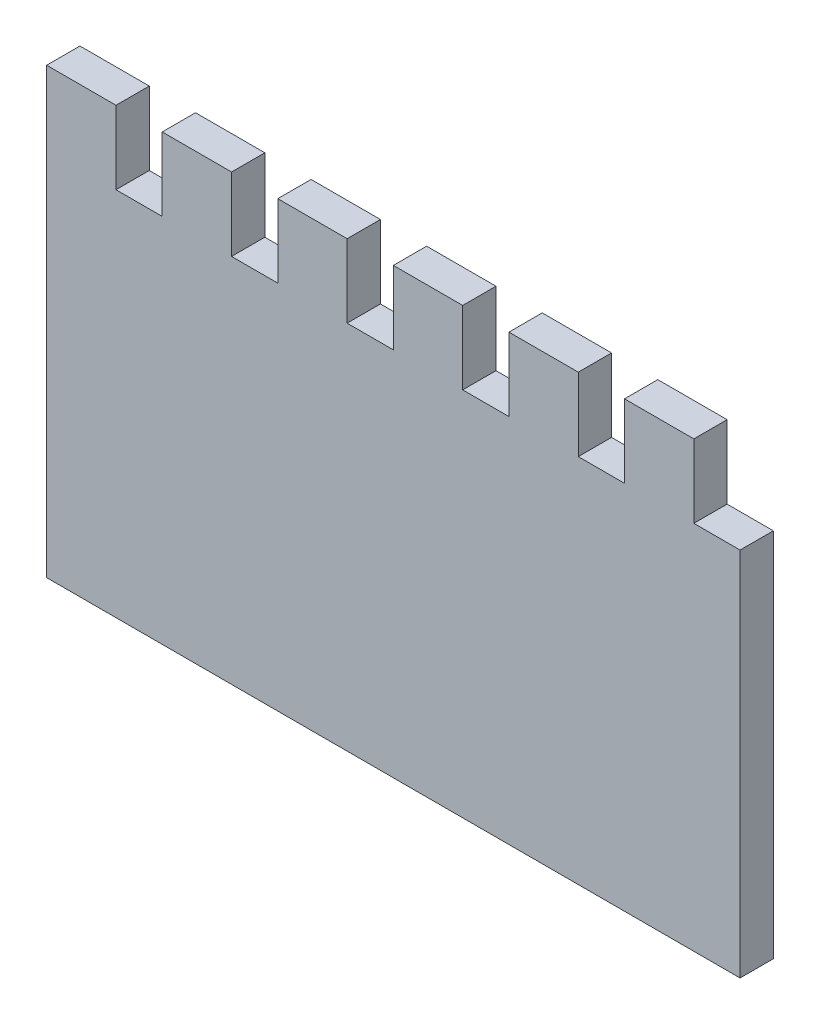
ISO-10303-21;
HEADER;
FILE_DESCRIPTION(('STEP AP214'),'2;1');
FILE_NAME('part.step','',(''),(''),'','','');
FILE_SCHEMA(('AUTOMOTIVE_DESIGN { 1 0 10303 214 1 1 1 1 }'));
ENDSEC;
DATA;
#1=APPLICATION_CONTEXT('core data for automotive mechanical design processes');
#2=APPLICATION_PROTOCOL_DEFINITION('international standard','automotive_design',2000,#1);
#3=PRODUCT_CONTEXT('',#1,'mechanical');
#4=PRODUCT('Part','Part','',(#3));
#5=PRODUCT_RELATED_PRODUCT_CATEGORY('part','',(#4));
#6=PRODUCT_DEFINITION_FORMATION('','',#4);
#7=PRODUCT_DEFINITION_CONTEXT('part definition',#1,'design');
#8=PRODUCT_DEFINITION('design','',#6,#7);
#9=PRODUCT_DEFINITION_SHAPE('','',#8);
#10=(LENGTH_UNIT() NAMED_UNIT(*) SI_UNIT(.MILLI.,.METRE.));
#11=(NAMED_UNIT(*) PLANE_ANGLE_UNIT() SI_UNIT($,.RADIAN.));
#12=(NAMED_UNIT(*) SI_UNIT($,.STERADIAN.) SOLID_ANGLE_UNIT());
#13=UNCERTAINTY_MEASURE_WITH_UNIT(LENGTH_MEASURE(1.E-05),#10,'distance_accuracy_value','');
#14=(GEOMETRIC_REPRESENTATION_CONTEXT(3) GLOBAL_UNCERTAINTY_ASSIGNED_CONTEXT((#13)) GLOBAL_UNIT_ASSIGNED_CONTEXT((#10,
#11,#12)) REPRESENTATION_CONTEXT('',''));
#15=CARTESIAN_POINT('',(0.,0.,0.));
#16=DIRECTION('',(0.,0.,1.));
#17=DIRECTION('',(1.,0.,0.));
#18=AXIS2_PLACEMENT_3D('',#15,#16,#17);
#19=CARTESIAN_POINT('',(0.,24384.,1828.8));
#20=DIRECTION('',(0.,-1.,0.));
#21=DIRECTION('',(0.,0.,-1.));
#22=AXIS2_PLACEMENT_3D('',#19,#20,#21);
#23=PLANE('',#22);
#24=DIRECTION('',(0.,0.,1.));
#25=VECTOR('',#24,1.);
#26=CARTESIAN_POINT('',(35560.,24384.,0.));
#27=LINE('',#26,#25);
#28=CARTESIAN_POINT('',(35560.,24384.,0.));
#29=VERTEX_POINT('',#28);
#30=CARTESIAN_POINT('',(35560.,24384.,1828.8));
#31=VERTEX_POINT('',#30);
#32=EDGE_CURVE('E215',#29,#31,#27,.T.);
#33=ORIENTED_EDGE('',*,*,#32,.F.);
#34=DIRECTION('',(-1.,0.,0.));
#35=VECTOR('',#34,1.);
#36=CARTESIAN_POINT('',(0.,24384.,0.));
#37=LINE('',#36,#35);
#38=CARTESIAN_POINT('',(31750.,24384.,0.));
#39=VERTEX_POINT('',#38);
#40=EDGE_CURVE('E234',#29,#39,#37,.T.);
#41=ORIENTED_EDGE('',*,*,#40,.T.);
#42=DIRECTION('',(0.,0.,1.));
#43=VECTOR('',#42,1.);
#44=CARTESIAN_POINT('',(31750.,24384.,0.));
#45=LINE('',#44,#43);
#46=CARTESIAN_POINT('',(31750.,24384.,1828.8));
#47=VERTEX_POINT('',#46);
#48=EDGE_CURVE('E376',#39,#47,#45,.T.);
#49=ORIENTED_EDGE('',*,*,#48,.T.);
#50=DIRECTION('',(-1.,0.,0.));
#51=VECTOR('',#50,1.);
#52=CARTESIAN_POINT('',(0.,24384.,1828.8));
#53=LINE('',#52,#51);
#54=EDGE_CURVE('E243',#31,#47,#53,.T.);
#55=ORIENTED_EDGE('',*,*,#54,.F.);
#56=EDGE_LOOP('',(#33,#41,#49,#55));
#57=FACE_BOUND('',#56,.T.);
#58=ADVANCED_FACE('F34',(#57),#23,.F.);
#59=CARTESIAN_POINT('',(0.,0.,1828.8));
#60=DIRECTION('',(0.,0.,-1.));
#61=DIRECTION('',(-1.,0.,0.));
#62=AXIS2_PLACEMENT_3D('',#59,#60,#61);
#63=PLANE('',#62);
#64=DIRECTION('',(-1.,0.,0.));
#65=VECTOR('',#64,1.);
#66=CARTESIAN_POINT('',(-1.1393720921813E-10,20364.7505525804,1828.8));
#67=LINE('',#66,#65);
#68=CARTESIAN_POINT('',(38100.,20364.7505525806,1828.8));
#69=VERTEX_POINT('',#68);
#70=CARTESIAN_POINT('',(35560.,20364.7505525806,1828.8));
#71=VERTEX_POINT('',#70);
#72=EDGE_CURVE('E49',#69,#71,#67,.T.);
#73=ORIENTED_EDGE('',*,*,#72,.T.);
#74=DIRECTION('',(0.,1.,0.));
#75=VECTOR('',#74,1.);
#76=CARTESIAN_POINT('',(35560.,0.,1828.8));
#77=LINE('',#76,#75);
#78=EDGE_CURVE('E224',#71,#31,#77,.T.);
#79=ORIENTED_EDGE('',*,*,#78,.T.);
#80=ORIENTED_EDGE('',*,*,#54,.T.);
#81=DIRECTION('',(0.,-1.,0.));
#82=VECTOR('',#81,1.);
#83=CARTESIAN_POINT('',(31750.0000000001,8.4193823332617E-11,1828.8));
#84=LINE('',#83,#82);
#85=CARTESIAN_POINT('',(31750.,20364.7505525806,1828.8));
#86=VERTEX_POINT('',#85);
#87=EDGE_CURVE('E380',#47,#86,#84,.T.);
#88=ORIENTED_EDGE('',*,*,#87,.T.);
#89=DIRECTION('',(1.,0.,0.));
#90=VECTOR('',#89,1.);
#91=CARTESIAN_POINT('',(1.13937209218131E-10,20364.7505525808,1828.8));
#92=LINE('',#91,#90);
#93=CARTESIAN_POINT('',(29210.,20364.7505525806,1828.8));
#94=VERTEX_POINT('',#93);
#95=EDGE_CURVE('E383',#94,#86,#92,.T.);
#96=ORIENTED_EDGE('',*,*,#95,.F.);
#97=DIRECTION('',(0.,1.,0.));
#98=VECTOR('',#97,1.);
#99=CARTESIAN_POINT('',(29210.,0.,1828.8));
#100=LINE('',#99,#98);
#101=CARTESIAN_POINT('',(29210.,24384.,1828.8));
#102=VERTEX_POINT('',#101);
#103=EDGE_CURVE('E385',#94,#102,#100,.T.);
#104=ORIENTED_EDGE('',*,*,#103,.T.);
#105=CARTESIAN_POINT('',(25400.,24384.,1828.8));
#106=VERTEX_POINT('',#105);
#107=EDGE_CURVE('E249',#102,#106,#53,.T.);
#108=ORIENTED_EDGE('',*,*,#107,.T.);
#109=DIRECTION('',(0.,-1.,0.));
#110=VECTOR('',#109,1.);
#111=CARTESIAN_POINT('',(25400.,0.,1828.8));
#112=LINE('',#111,#110);
#113=CARTESIAN_POINT('',(25400.,20364.7505525806,1828.8));
#114=VERTEX_POINT('',#113);
#115=EDGE_CURVE('E361',#106,#114,#112,.T.);
#116=ORIENTED_EDGE('',*,*,#115,.T.);
#117=DIRECTION('',(-1.,0.,0.));
#118=VECTOR('',#117,1.);
#119=CARTESIAN_POINT('',(5.69686046090657E-11,20364.7505525807,1828.8));
#120=LINE('',#119,#118);
#121=CARTESIAN_POINT('',(22860.,20364.7505525806,1828.8));
#122=VERTEX_POINT('',#121);
#123=EDGE_CURVE('E364',#114,#122,#120,.T.);
#124=ORIENTED_EDGE('',*,*,#123,.T.);
#125=DIRECTION('',(0.,1.,0.));
#126=VECTOR('',#125,1.);
#127=CARTESIAN_POINT('',(22860.,0.,1828.8));
#128=LINE('',#127,#126);
#129=CARTESIAN_POINT('',(22860.,24384.,1828.8));
#130=VERTEX_POINT('',#129);
#131=EDGE_CURVE('E357',#122,#130,#128,.T.);
#132=ORIENTED_EDGE('',*,*,#131,.T.);
#133=CARTESIAN_POINT('',(19050.,24384.,1828.8));
#134=VERTEX_POINT('',#133);
#135=EDGE_CURVE('E257',#130,#134,#53,.T.);
#136=ORIENTED_EDGE('',*,*,#135,.T.);
#137=DIRECTION('',(0.,-1.,0.));
#138=VECTOR('',#137,1.);
#139=CARTESIAN_POINT('',(19050.,1.68387646665235E-11,1828.8));
#140=LINE('',#139,#138);
#141=CARTESIAN_POINT('',(19050.,20364.7505525806,1828.8));
#142=VERTEX_POINT('',#141);
#143=EDGE_CURVE('E329',#134,#142,#140,.T.);
#144=ORIENTED_EDGE('',*,*,#143,.T.);
#145=DIRECTION('',(1.,0.,0.));
#146=VECTOR('',#145,1.);
#147=CARTESIAN_POINT('',(-5.69686046090653E-11,20364.7505525806,1828.8));
#148=LINE('',#147,#146);
#149=CARTESIAN_POINT('',(16510.,20364.7505525806,1828.8));
#150=VERTEX_POINT('',#149);
#151=EDGE_CURVE('E333',#150,#142,#148,.T.);
#152=ORIENTED_EDGE('',*,*,#151,.F.);
#153=DIRECTION('',(0.,-1.,0.));
#154=VECTOR('',#153,1.);
#155=CARTESIAN_POINT('',(16510.,0.,1828.8));
#156=LINE('',#155,#154);
#157=CARTESIAN_POINT('',(16510.,24384.,1828.8));
#158=VERTEX_POINT('',#157);
#159=EDGE_CURVE('E336',#158,#150,#156,.T.);
#160=ORIENTED_EDGE('',*,*,#159,.F.);
#161=CARTESIAN_POINT('',(12700.,24384.,1828.8));
#162=VERTEX_POINT('',#161);
#163=EDGE_CURVE('E264',#158,#162,#53,.T.);
#164=ORIENTED_EDGE('',*,*,#163,.T.);
#165=DIRECTION('',(0.,-1.,0.));
#166=VECTOR('',#165,1.);
#167=CARTESIAN_POINT('',(12700.,-5.6129215555078E-12,1828.8));
#168=LINE('',#167,#166);
#169=CARTESIAN_POINT('',(12700.,20364.7505525806,1828.8));
#170=VERTEX_POINT('',#169);
#171=EDGE_CURVE('E309',#162,#170,#168,.T.);
#172=ORIENTED_EDGE('',*,*,#171,.T.);
#173=DIRECTION('',(-1.,0.,0.));
#174=VECTOR('',#173,1.);
#175=CARTESIAN_POINT('',(2.27874418436264E-10,20364.7505525807,1828.8));
#176=LINE('',#175,#174);
#177=CARTESIAN_POINT('',(10160.,20364.7505525806,1828.8));
#178=VERTEX_POINT('',#177);
#179=EDGE_CURVE('E312',#170,#178,#176,.T.);
#180=ORIENTED_EDGE('',*,*,#179,.T.);
#181=DIRECTION('',(0.,1.,0.));
#182=VECTOR('',#181,1.);
#183=CARTESIAN_POINT('',(10160.,0.,1828.8));
#184=LINE('',#183,#182);
#185=CARTESIAN_POINT('',(10160.,24384.,1828.8));
#186=VERTEX_POINT('',#185);
#187=EDGE_CURVE('E305',#178,#186,#184,.T.);
#188=ORIENTED_EDGE('',*,*,#187,.T.);
#189=CARTESIAN_POINT('',(6350.,24384.,1828.8));
#190=VERTEX_POINT('',#189);
#191=EDGE_CURVE('E259',#186,#190,#53,.T.);
#192=ORIENTED_EDGE('',*,*,#191,.T.);
#193=DIRECTION('',(0.,-1.,0.));
#194=VECTOR('',#193,1.);
#195=CARTESIAN_POINT('',(6350.00000000001,1.40323038887696E-12,1828.8));
#196=LINE('',#195,#194);
#197=CARTESIAN_POINT('',(6350.,20364.7505525806,1828.8));
#198=VERTEX_POINT('',#197);
#199=EDGE_CURVE('E279',#190,#198,#196,.T.);
#200=ORIENTED_EDGE('',*,*,#199,.T.);
#201=DIRECTION('',(1.,0.,0.));
#202=VECTOR('',#201,1.);
#203=CARTESIAN_POINT('',(-2.27874418436261E-10,20364.7505525806,1828.8));
#204=LINE('',#203,#202);
#205=CARTESIAN_POINT('',(3810.,20364.7505525806,1828.8));
#206=VERTEX_POINT('',#205);
#207=EDGE_CURVE('E283',#206,#198,#204,.T.);
#208=ORIENTED_EDGE('',*,*,#207,.F.);
#209=DIRECTION('',(0.,1.,0.));
#210=VECTOR('',#209,1.);
#211=CARTESIAN_POINT('',(3810.,0.,1828.8));
#212=LINE('',#211,#210);
#213=CARTESIAN_POINT('',(3810.,24384.,1828.8));
#214=VERTEX_POINT('',#213);
#215=EDGE_CURVE('E286',#206,#214,#212,.T.);
#216=ORIENTED_EDGE('',*,*,#215,.T.);
#217=CARTESIAN_POINT('',(0.,24384.,1828.8));
#218=VERTEX_POINT('',#217);
#219=EDGE_CURVE('E251',#214,#218,#53,.T.);
#220=ORIENTED_EDGE('',*,*,#219,.T.);
#221=DIRECTION('',(0.,-1.,0.));
#222=VECTOR('',#221,1.);
#223=CARTESIAN_POINT('',(0.,0.,1828.8));
#224=LINE('',#223,#222);
#225=CARTESIAN_POINT('',(0.,0.,1828.8));
#226=VERTEX_POINT('',#225);
#227=EDGE_CURVE('E239',#218,#226,#224,.T.);
#228=ORIENTED_EDGE('',*,*,#227,.T.);
#229=DIRECTION('',(1.,0.,0.));
#230=VECTOR('',#229,1.);
#231=CARTESIAN_POINT('',(0.,0.,1828.8));
#232=LINE('',#231,#230);
#233=CARTESIAN_POINT('',(38100.,0.,1828.8));
#234=VERTEX_POINT('',#233);
#235=EDGE_CURVE('E265',#226,#234,#232,.T.);
#236=ORIENTED_EDGE('',*,*,#235,.T.);
#237=DIRECTION('',(0.,1.,0.));
#238=VECTOR('',#237,1.);
#239=CARTESIAN_POINT('',(38100.,0.,1828.8));
#240=LINE('',#239,#238);
#241=EDGE_CURVE('E260',#234,#69,#240,.T.);
#242=ORIENTED_EDGE('',*,*,#241,.T.);
#243=EDGE_LOOP('',(#73,#79,#80,#88,#96,#104,#108,#116,#124,#132,#136,#144,#152,#160,#164,#172,
#180,#188,#192,#200,#208,#216,#220,#228,#236,#242));
#244=FACE_BOUND('',#243,.T.);
#245=ADVANCED_FACE('F408',(#244),#63,.F.);
#246=CARTESIAN_POINT('',(0.,0.,0.));
#247=DIRECTION('',(0.,0.,-1.));
#248=DIRECTION('',(-1.,0.,0.));
#249=AXIS2_PLACEMENT_3D('',#246,#247,#248);
#250=PLANE('',#249);
#251=DIRECTION('',(0.,1.,0.));
#252=VECTOR('',#251,1.);
#253=CARTESIAN_POINT('',(35560.,0.,0.));
#254=LINE('',#253,#252);
#255=CARTESIAN_POINT('',(35560.,20364.7505525806,0.));
#256=VERTEX_POINT('',#255);
#257=EDGE_CURVE('E216',#256,#29,#254,.T.);
#258=ORIENTED_EDGE('',*,*,#257,.F.);
#259=DIRECTION('',(-1.,0.,0.));
#260=VECTOR('',#259,1.);
#261=CARTESIAN_POINT('',(-1.1393720921813E-10,20364.7505525804,0.));
#262=LINE('',#261,#260);
#263=CARTESIAN_POINT('',(38100.,20364.7505525806,0.));
#264=VERTEX_POINT('',#263);
#265=EDGE_CURVE('E209',#264,#256,#262,.T.);
#266=ORIENTED_EDGE('',*,*,#265,.F.);
#267=DIRECTION('',(0.,1.,0.));
#268=VECTOR('',#267,1.);
#269=CARTESIAN_POINT('',(38100.,0.,0.));
#270=LINE('',#269,#268);
#271=CARTESIAN_POINT('',(38100.,0.,0.));
#272=VERTEX_POINT('',#271);
#273=EDGE_CURVE('E222',#272,#264,#270,.T.);
#274=ORIENTED_EDGE('',*,*,#273,.F.);
#275=DIRECTION('',(1.,0.,0.));
#276=VECTOR('',#275,1.);
#277=CARTESIAN_POINT('',(0.,0.,0.));
#278=LINE('',#277,#276);
#279=CARTESIAN_POINT('',(0.,0.,0.));
#280=VERTEX_POINT('',#279);
#281=EDGE_CURVE('E230',#280,#272,#278,.T.);
#282=ORIENTED_EDGE('',*,*,#281,.F.);
#283=DIRECTION('',(0.,-1.,0.));
#284=VECTOR('',#283,1.);
#285=CARTESIAN_POINT('',(0.,0.,0.));
#286=LINE('',#285,#284);
#287=CARTESIAN_POINT('',(0.,24384.,0.));
#288=VERTEX_POINT('',#287);
#289=EDGE_CURVE('E235',#288,#280,#286,.T.);
#290=ORIENTED_EDGE('',*,*,#289,.F.);
#291=CARTESIAN_POINT('',(3810.,24384.,0.));
#292=VERTEX_POINT('',#291);
#293=EDGE_CURVE('E229',#292,#288,#37,.T.);
#294=ORIENTED_EDGE('',*,*,#293,.F.);
#295=DIRECTION('',(0.,1.,0.));
#296=VECTOR('',#295,1.);
#297=CARTESIAN_POINT('',(3810.,0.,0.));
#298=LINE('',#297,#296);
#299=CARTESIAN_POINT('',(3810.,20364.7505525806,0.));
#300=VERTEX_POINT('',#299);
#301=EDGE_CURVE('E282',#300,#292,#298,.T.);
#302=ORIENTED_EDGE('',*,*,#301,.F.);
#303=DIRECTION('',(1.,0.,0.));
#304=VECTOR('',#303,1.);
#305=CARTESIAN_POINT('',(-2.27874418436261E-10,20364.7505525806,0.));
#306=LINE('',#305,#304);
#307=CARTESIAN_POINT('',(6350.,20364.7505525806,0.));
#308=VERTEX_POINT('',#307);
#309=EDGE_CURVE('E291',#300,#308,#306,.T.);
#310=ORIENTED_EDGE('',*,*,#309,.T.);
#311=DIRECTION('',(0.,-1.,0.));
#312=VECTOR('',#311,1.);
#313=CARTESIAN_POINT('',(6350.00000000001,1.40323038887696E-12,0.));
#314=LINE('',#313,#312);
#315=CARTESIAN_POINT('',(6350.,24384.,0.));
#316=VERTEX_POINT('',#315);
#317=EDGE_CURVE('E272',#316,#308,#314,.T.);
#318=ORIENTED_EDGE('',*,*,#317,.F.);
#319=CARTESIAN_POINT('',(10160.,24384.,0.));
#320=VERTEX_POINT('',#319);
#321=EDGE_CURVE('E232',#320,#316,#37,.T.);
#322=ORIENTED_EDGE('',*,*,#321,.F.);
#323=DIRECTION('',(0.,1.,0.));
#324=VECTOR('',#323,1.);
#325=CARTESIAN_POINT('',(10160.,0.,0.));
#326=LINE('',#325,#324);
#327=CARTESIAN_POINT('',(10160.,20364.7505525806,0.));
#328=VERTEX_POINT('',#327);
#329=EDGE_CURVE('E298',#328,#320,#326,.T.);
#330=ORIENTED_EDGE('',*,*,#329,.F.);
#331=DIRECTION('',(-1.,0.,0.));
#332=VECTOR('',#331,1.);
#333=CARTESIAN_POINT('',(2.27874418436264E-10,20364.7505525807,0.));
#334=LINE('',#333,#332);
#335=CARTESIAN_POINT('',(12700.,20364.7505525806,0.));
#336=VERTEX_POINT('',#335);
#337=EDGE_CURVE('E308',#336,#328,#334,.T.);
#338=ORIENTED_EDGE('',*,*,#337,.F.);
#339=DIRECTION('',(0.,-1.,0.));
#340=VECTOR('',#339,1.);
#341=CARTESIAN_POINT('',(12700.,-5.6129215555078E-12,0.));
#342=LINE('',#341,#340);
#343=CARTESIAN_POINT('',(12700.,24384.,0.));
#344=VERTEX_POINT('',#343);
#345=EDGE_CURVE('E317',#344,#336,#342,.T.);
#346=ORIENTED_EDGE('',*,*,#345,.F.);
#347=CARTESIAN_POINT('',(16510.,24384.,0.));
#348=VERTEX_POINT('',#347);
#349=EDGE_CURVE('E422',#348,#344,#37,.T.);
#350=ORIENTED_EDGE('',*,*,#349,.F.);
#351=DIRECTION('',(0.,-1.,0.));
#352=VECTOR('',#351,1.);
#353=CARTESIAN_POINT('',(16510.,0.,0.));
#354=LINE('',#353,#352);
#355=CARTESIAN_POINT('',(16510.,20364.7505525806,0.));
#356=VERTEX_POINT('',#355);
#357=EDGE_CURVE('E332',#348,#356,#354,.T.);
#358=ORIENTED_EDGE('',*,*,#357,.T.);
#359=DIRECTION('',(1.,0.,0.));
#360=VECTOR('',#359,1.);
#361=CARTESIAN_POINT('',(-5.69686046090653E-11,20364.7505525806,0.));
#362=LINE('',#361,#360);
#363=CARTESIAN_POINT('',(19050.,20364.7505525806,0.));
#364=VERTEX_POINT('',#363);
#365=EDGE_CURVE('E342',#356,#364,#362,.T.);
#366=ORIENTED_EDGE('',*,*,#365,.T.);
#367=DIRECTION('',(0.,-1.,0.));
#368=VECTOR('',#367,1.);
#369=CARTESIAN_POINT('',(19050.,1.68387646665235E-11,0.));
#370=LINE('',#369,#368);
#371=CARTESIAN_POINT('',(19050.,24384.,0.));
#372=VERTEX_POINT('',#371);
#373=EDGE_CURVE('E323',#372,#364,#370,.T.);
#374=ORIENTED_EDGE('',*,*,#373,.F.);
#375=CARTESIAN_POINT('',(22860.,24384.,0.));
#376=VERTEX_POINT('',#375);
#377=EDGE_CURVE('E421',#376,#372,#37,.T.);
#378=ORIENTED_EDGE('',*,*,#377,.F.);
#379=DIRECTION('',(0.,1.,0.));
#380=VECTOR('',#379,1.);
#381=CARTESIAN_POINT('',(22860.,0.,0.));
#382=LINE('',#381,#380);
#383=CARTESIAN_POINT('',(22860.,20364.7505525806,0.));
#384=VERTEX_POINT('',#383);
#385=EDGE_CURVE('E350',#384,#376,#382,.T.);
#386=ORIENTED_EDGE('',*,*,#385,.F.);
#387=DIRECTION('',(-1.,0.,0.));
#388=VECTOR('',#387,1.);
#389=CARTESIAN_POINT('',(5.69686046090657E-11,20364.7505525807,0.));
#390=LINE('',#389,#388);
#391=CARTESIAN_POINT('',(25400.,20364.7505525806,0.));
#392=VERTEX_POINT('',#391);
#393=EDGE_CURVE('E360',#392,#384,#390,.T.);
#394=ORIENTED_EDGE('',*,*,#393,.F.);
#395=DIRECTION('',(0.,-1.,0.));
#396=VECTOR('',#395,1.);
#397=CARTESIAN_POINT('',(25400.,0.,0.));
#398=LINE('',#397,#396);
#399=CARTESIAN_POINT('',(25400.,24384.,0.));
#400=VERTEX_POINT('',#399);
#401=EDGE_CURVE('E369',#400,#392,#398,.T.);
#402=ORIENTED_EDGE('',*,*,#401,.F.);
#403=CARTESIAN_POINT('',(29210.,24384.,0.));
#404=VERTEX_POINT('',#403);
#405=EDGE_CURVE('E240',#404,#400,#37,.T.);
#406=ORIENTED_EDGE('',*,*,#405,.F.);
#407=DIRECTION('',(0.,1.,0.));
#408=VECTOR('',#407,1.);
#409=CARTESIAN_POINT('',(29210.,0.,0.));
#410=LINE('',#409,#408);
#411=CARTESIAN_POINT('',(29210.,20364.7505525806,0.));
#412=VERTEX_POINT('',#411);
#413=EDGE_CURVE('E382',#412,#404,#410,.T.);
#414=ORIENTED_EDGE('',*,*,#413,.F.);
#415=DIRECTION('',(1.,0.,0.));
#416=VECTOR('',#415,1.);
#417=CARTESIAN_POINT('',(1.13937209218131E-10,20364.7505525808,0.));
#418=LINE('',#417,#416);
#419=CARTESIAN_POINT('',(31750.,20364.7505525806,0.));
#420=VERTEX_POINT('',#419);
#421=EDGE_CURVE('E390',#412,#420,#418,.T.);
#422=ORIENTED_EDGE('',*,*,#421,.T.);
#423=DIRECTION('',(0.,-1.,0.));
#424=VECTOR('',#423,1.);
#425=CARTESIAN_POINT('',(31750.0000000001,8.4193823332617E-11,0.));
#426=LINE('',#425,#424);
#427=EDGE_CURVE('E374',#39,#420,#426,.T.);
#428=ORIENTED_EDGE('',*,*,#427,.F.);
#429=ORIENTED_EDGE('',*,*,#40,.F.);
#430=EDGE_LOOP('',(#258,#266,#274,#282,#290,#294,#302,#310,#318,#322,#330,#338,#346,#350,#358,
#366,#374,#378,#386,#394,#402,#406,#414,#422,#428,#429));
#431=FACE_BOUND('',#430,.T.);
#432=ADVANCED_FACE('F221',(#431),#250,.T.);
#433=CARTESIAN_POINT('',(38100.,0.,1828.8));
#434=DIRECTION('',(-1.,0.,0.));
#435=DIRECTION('',(0.,0.,1.));
#436=AXIS2_PLACEMENT_3D('',#433,#434,#435);
#437=PLANE('',#436);
#438=DIRECTION('',(0.,0.,1.));
#439=VECTOR('',#438,1.);
#440=CARTESIAN_POINT('',(38100.,20364.7505525806,0.));
#441=LINE('',#440,#439);
#442=EDGE_CURVE('E206',#264,#69,#441,.T.);
#443=ORIENTED_EDGE('',*,*,#442,.T.);
#444=ORIENTED_EDGE('',*,*,#241,.F.);
#445=DIRECTION('',(0.,0.,-1.));
#446=VECTOR('',#445,1.);
#447=CARTESIAN_POINT('',(38100.,0.,1828.8));
#448=LINE('',#447,#446);
#449=EDGE_CURVE('E42',#234,#272,#448,.T.);
#450=ORIENTED_EDGE('',*,*,#449,.T.);
#451=ORIENTED_EDGE('',*,*,#273,.T.);
#452=EDGE_LOOP('',(#443,#444,#450,#451));
#453=FACE_BOUND('',#452,.T.);
#454=ADVANCED_FACE('F227',(#453),#437,.F.);
#455=DIRECTION('',(0.,0.,1.));
#456=VECTOR('',#455,1.);
#457=CARTESIAN_POINT('',(29210.,24384.,0.));
#458=LINE('',#457,#456);
#459=EDGE_CURVE('E367',#404,#102,#458,.T.);
#460=ORIENTED_EDGE('',*,*,#459,.F.);
#461=ORIENTED_EDGE('',*,*,#405,.T.);
#462=DIRECTION('',(0.,0.,1.));
#463=VECTOR('',#462,1.);
#464=CARTESIAN_POINT('',(25400.,24384.,0.));
#465=LINE('',#464,#463);
#466=EDGE_CURVE('E349',#400,#106,#465,.T.);
#467=ORIENTED_EDGE('',*,*,#466,.T.);
#468=ORIENTED_EDGE('',*,*,#107,.F.);
#469=EDGE_LOOP('',(#460,#461,#467,#468));
#470=FACE_BOUND('',#469,.T.);
#471=ADVANCED_FACE('F417',(#470),#23,.F.);
#472=DIRECTION('',(0.,0.,1.));
#473=VECTOR('',#472,1.);
#474=CARTESIAN_POINT('',(22860.,24384.,0.));
#475=LINE('',#474,#473);
#476=EDGE_CURVE('E353',#376,#130,#475,.T.);
#477=ORIENTED_EDGE('',*,*,#476,.F.);
#478=ORIENTED_EDGE('',*,*,#377,.T.);
#479=DIRECTION('',(0.,0.,1.));
#480=VECTOR('',#479,1.);
#481=CARTESIAN_POINT('',(19050.,24384.,0.));
#482=LINE('',#481,#480);
#483=EDGE_CURVE('E325',#372,#134,#482,.T.);
#484=ORIENTED_EDGE('',*,*,#483,.T.);
#485=ORIENTED_EDGE('',*,*,#135,.F.);
#486=EDGE_LOOP('',(#477,#478,#484,#485));
#487=FACE_BOUND('',#486,.T.);
#488=ADVANCED_FACE('F470',(#487),#23,.F.);
#489=DIRECTION('',(0.,0.,1.));
#490=VECTOR('',#489,1.);
#491=CARTESIAN_POINT('',(10160.,24384.,0.));
#492=LINE('',#491,#490);
#493=EDGE_CURVE('E301',#320,#186,#492,.T.);
#494=ORIENTED_EDGE('',*,*,#493,.F.);
#495=ORIENTED_EDGE('',*,*,#321,.T.);
#496=DIRECTION('',(0.,0.,1.));
#497=VECTOR('',#496,1.);
#498=CARTESIAN_POINT('',(6350.,24384.,0.));
#499=LINE('',#498,#497);
#500=EDGE_CURVE('E274',#316,#190,#499,.T.);
#501=ORIENTED_EDGE('',*,*,#500,.T.);
#502=ORIENTED_EDGE('',*,*,#191,.F.);
#503=EDGE_LOOP('',(#494,#495,#501,#502));
#504=FACE_BOUND('',#503,.T.);
#505=ADVANCED_FACE('F435',(#504),#23,.F.);
#506=ORIENTED_EDGE('',*,*,#163,.F.);
#507=DIRECTION('',(0.,0.,1.));
#508=VECTOR('',#507,1.);
#509=CARTESIAN_POINT('',(16510.,24384.,0.));
#510=LINE('',#509,#508);
#511=EDGE_CURVE('E315',#348,#158,#510,.T.);
#512=ORIENTED_EDGE('',*,*,#511,.F.);
#513=ORIENTED_EDGE('',*,*,#349,.T.);
#514=DIRECTION('',(0.,0.,1.));
#515=VECTOR('',#514,1.);
#516=CARTESIAN_POINT('',(12700.,24384.,0.));
#517=LINE('',#516,#515);
#518=EDGE_CURVE('E297',#344,#162,#517,.T.);
#519=ORIENTED_EDGE('',*,*,#518,.T.);
#520=EDGE_LOOP('',(#506,#512,#513,#519));
#521=FACE_BOUND('',#520,.T.);
#522=ADVANCED_FACE('F462',(#521),#23,.F.);
#523=DIRECTION('',(0.,0.,1.));
#524=VECTOR('',#523,1.);
#525=CARTESIAN_POINT('',(3810.,24384.,0.));
#526=LINE('',#525,#524);
#527=EDGE_CURVE('E277',#292,#214,#526,.T.);
#528=ORIENTED_EDGE('',*,*,#527,.F.);
#529=ORIENTED_EDGE('',*,*,#293,.T.);
#530=DIRECTION('',(0.,0.,-1.));
#531=VECTOR('',#530,1.);
#532=CARTESIAN_POINT('',(0.,24384.,1828.8));
#533=LINE('',#532,#531);
#534=EDGE_CURVE('E241',#218,#288,#533,.T.);
#535=ORIENTED_EDGE('',*,*,#534,.F.);
#536=ORIENTED_EDGE('',*,*,#219,.F.);
#537=EDGE_LOOP('',(#528,#529,#535,#536));
#538=FACE_BOUND('',#537,.T.);
#539=ADVANCED_FACE('F477',(#538),#23,.F.);
#540=CARTESIAN_POINT('',(0.,0.,1828.8));
#541=DIRECTION('',(1.,0.,0.));
#542=DIRECTION('',(0.,0.,-1.));
#543=AXIS2_PLACEMENT_3D('',#540,#541,#542);
#544=PLANE('',#543);
#545=ORIENTED_EDGE('',*,*,#289,.T.);
#546=DIRECTION('',(0.,0.,-1.));
#547=VECTOR('',#546,1.);
#548=CARTESIAN_POINT('',(0.,0.,1828.8));
#549=LINE('',#548,#547);
#550=EDGE_CURVE('E11',#226,#280,#549,.T.);
#551=ORIENTED_EDGE('',*,*,#550,.F.);
#552=ORIENTED_EDGE('',*,*,#227,.F.);
#553=ORIENTED_EDGE('',*,*,#534,.T.);
#554=EDGE_LOOP('',(#545,#551,#552,#553));
#555=FACE_BOUND('',#554,.T.);
#556=ADVANCED_FACE('F36',(#555),#544,.F.);
#557=CARTESIAN_POINT('',(0.,0.,1828.8));
#558=DIRECTION('',(0.,1.,0.));
#559=DIRECTION('',(0.,0.,1.));
#560=AXIS2_PLACEMENT_3D('',#557,#558,#559);
#561=PLANE('',#560);
#562=ORIENTED_EDGE('',*,*,#281,.T.);
#563=ORIENTED_EDGE('',*,*,#449,.F.);
#564=ORIENTED_EDGE('',*,*,#235,.F.);
#565=ORIENTED_EDGE('',*,*,#550,.T.);
#566=EDGE_LOOP('',(#562,#563,#564,#565));
#567=FACE_BOUND('',#566,.T.);
#568=ADVANCED_FACE('F491',(#567),#561,.F.);
#569=CARTESIAN_POINT('',(3810.,0.,0.));
#570=DIRECTION('',(1.,0.,0.));
#571=DIRECTION('',(0.,0.,-1.));
#572=AXIS2_PLACEMENT_3D('',#569,#570,#571);
#573=PLANE('',#572);
#574=ORIENTED_EDGE('',*,*,#215,.F.);
#575=DIRECTION('',(0.,0.,1.));
#576=VECTOR('',#575,1.);
#577=CARTESIAN_POINT('',(3810.,20364.7505525806,0.));
#578=LINE('',#577,#576);
#579=EDGE_CURVE('E269',#300,#206,#578,.T.);
#580=ORIENTED_EDGE('',*,*,#579,.F.);
#581=ORIENTED_EDGE('',*,*,#301,.T.);
#582=ORIENTED_EDGE('',*,*,#527,.T.);
#583=EDGE_LOOP('',(#574,#580,#581,#582));
#584=FACE_BOUND('',#583,.T.);
#585=ADVANCED_FACE('F497',(#584),#573,.T.);
#586=CARTESIAN_POINT('',(6350.00000000001,1.40323038887696E-12,0.));
#587=DIRECTION('',(-1.,0.,0.));
#588=DIRECTION('',(0.,-1.,0.));
#589=AXIS2_PLACEMENT_3D('',#586,#587,#588);
#590=PLANE('',#589);
#591=ORIENTED_EDGE('',*,*,#199,.F.);
#592=ORIENTED_EDGE('',*,*,#500,.F.);
#593=ORIENTED_EDGE('',*,*,#317,.T.);
#594=DIRECTION('',(0.,0.,1.));
#595=VECTOR('',#594,1.);
#596=CARTESIAN_POINT('',(6350.,20364.7505525806,0.));
#597=LINE('',#596,#595);
#598=EDGE_CURVE('E271',#308,#198,#597,.T.);
#599=ORIENTED_EDGE('',*,*,#598,.T.);
#600=EDGE_LOOP('',(#591,#592,#593,#599));
#601=FACE_BOUND('',#600,.T.);
#602=ADVANCED_FACE('F441',(#601),#590,.T.);
#603=CARTESIAN_POINT('',(-2.27874418436261E-10,20364.7505525806,0.));
#604=DIRECTION('',(0.,-1.,0.));
#605=DIRECTION('',(1.,0.,0.));
#606=AXIS2_PLACEMENT_3D('',#603,#604,#605);
#607=PLANE('',#606);
#608=ORIENTED_EDGE('',*,*,#207,.T.);
#609=ORIENTED_EDGE('',*,*,#598,.F.);
#610=ORIENTED_EDGE('',*,*,#309,.F.);
#611=ORIENTED_EDGE('',*,*,#579,.T.);
#612=EDGE_LOOP('',(#608,#609,#610,#611));
#613=FACE_BOUND('',#612,.T.);
#614=ADVANCED_FACE('F446',(#613),#607,.F.);
#615=CARTESIAN_POINT('',(2.27874418436264E-10,20364.7505525807,0.));
#616=DIRECTION('',(0.,1.,0.));
#617=DIRECTION('',(-1.,0.,0.));
#618=AXIS2_PLACEMENT_3D('',#615,#616,#617);
#619=PLANE('',#618);
#620=ORIENTED_EDGE('',*,*,#179,.F.);
#621=DIRECTION('',(0.,0.,1.));
#622=VECTOR('',#621,1.);
#623=CARTESIAN_POINT('',(12700.,20364.7505525806,0.));
#624=LINE('',#623,#622);
#625=EDGE_CURVE('E295',#336,#170,#624,.T.);
#626=ORIENTED_EDGE('',*,*,#625,.F.);
#627=ORIENTED_EDGE('',*,*,#337,.T.);
#628=DIRECTION('',(0.,0.,1.));
#629=VECTOR('',#628,1.);
#630=CARTESIAN_POINT('',(10160.,20364.7505525806,0.));
#631=LINE('',#630,#629);
#632=EDGE_CURVE('E288',#328,#178,#631,.T.);
#633=ORIENTED_EDGE('',*,*,#632,.T.);
#634=EDGE_LOOP('',(#620,#626,#627,#633));
#635=FACE_BOUND('',#634,.T.);
#636=ADVANCED_FACE('F454',(#635),#619,.T.);
#637=CARTESIAN_POINT('',(10160.,0.,0.));
#638=DIRECTION('',(1.,0.,0.));
#639=DIRECTION('',(0.,0.,-1.));
#640=AXIS2_PLACEMENT_3D('',#637,#638,#639);
#641=PLANE('',#640);
#642=ORIENTED_EDGE('',*,*,#187,.F.);
#643=ORIENTED_EDGE('',*,*,#632,.F.);
#644=ORIENTED_EDGE('',*,*,#329,.T.);
#645=ORIENTED_EDGE('',*,*,#493,.T.);
#646=EDGE_LOOP('',(#642,#643,#644,#645));
#647=FACE_BOUND('',#646,.T.);
#648=ADVANCED_FACE('F452',(#647),#641,.T.);
#649=CARTESIAN_POINT('',(12700.,-5.6129215555078E-12,0.));
#650=DIRECTION('',(-1.,0.,0.));
#651=DIRECTION('',(0.,-1.,0.));
#652=AXIS2_PLACEMENT_3D('',#649,#650,#651);
#653=PLANE('',#652);
#654=ORIENTED_EDGE('',*,*,#171,.F.);
#655=ORIENTED_EDGE('',*,*,#518,.F.);
#656=ORIENTED_EDGE('',*,*,#345,.T.);
#657=ORIENTED_EDGE('',*,*,#625,.T.);
#658=EDGE_LOOP('',(#654,#655,#656,#657));
#659=FACE_BOUND('',#658,.T.);
#660=ADVANCED_FACE('F460',(#659),#653,.T.);
#661=CARTESIAN_POINT('',(16510.,0.,0.));
#662=DIRECTION('',(-1.,0.,0.));
#663=DIRECTION('',(0.,0.,1.));
#664=AXIS2_PLACEMENT_3D('',#661,#662,#663);
#665=PLANE('',#664);
#666=ORIENTED_EDGE('',*,*,#159,.T.);
#667=DIRECTION('',(0.,0.,1.));
#668=VECTOR('',#667,1.);
#669=CARTESIAN_POINT('',(16510.,20364.7505525806,0.));
#670=LINE('',#669,#668);
#671=EDGE_CURVE('E320',#356,#150,#670,.T.);
#672=ORIENTED_EDGE('',*,*,#671,.F.);
#673=ORIENTED_EDGE('',*,*,#357,.F.);
#674=ORIENTED_EDGE('',*,*,#511,.T.);
#675=EDGE_LOOP('',(#666,#672,#673,#674));
#676=FACE_BOUND('',#675,.T.);
#677=ADVANCED_FACE('F517',(#676),#665,.F.);
#678=CARTESIAN_POINT('',(19050.,1.68387646665235E-11,0.));
#679=DIRECTION('',(-1.,0.,0.));
#680=DIRECTION('',(0.,-1.,0.));
#681=AXIS2_PLACEMENT_3D('',#678,#679,#680);
#682=PLANE('',#681);
#683=ORIENTED_EDGE('',*,*,#143,.F.);
#684=ORIENTED_EDGE('',*,*,#483,.F.);
#685=ORIENTED_EDGE('',*,*,#373,.T.);
#686=DIRECTION('',(0.,0.,1.));
#687=VECTOR('',#686,1.);
#688=CARTESIAN_POINT('',(19050.,20364.7505525806,0.));
#689=LINE('',#688,#687);
#690=EDGE_CURVE('E322',#364,#142,#689,.T.);
#691=ORIENTED_EDGE('',*,*,#690,.T.);
#692=EDGE_LOOP('',(#683,#684,#685,#691));
#693=FACE_BOUND('',#692,.T.);
#694=ADVANCED_FACE('F468',(#693),#682,.T.);
#695=CARTESIAN_POINT('',(-5.69686046090653E-11,20364.7505525806,0.));
#696=DIRECTION('',(0.,-1.,0.));
#697=DIRECTION('',(1.,0.,0.));
#698=AXIS2_PLACEMENT_3D('',#695,#696,#697);
#699=PLANE('',#698);
#700=ORIENTED_EDGE('',*,*,#151,.T.);
#701=ORIENTED_EDGE('',*,*,#690,.F.);
#702=ORIENTED_EDGE('',*,*,#365,.F.);
#703=ORIENTED_EDGE('',*,*,#671,.T.);
#704=EDGE_LOOP('',(#700,#701,#702,#703));
#705=FACE_BOUND('',#704,.T.);
#706=ADVANCED_FACE('F523',(#705),#699,.F.);
#707=CARTESIAN_POINT('',(5.69686046090657E-11,20364.7505525807,0.));
#708=DIRECTION('',(0.,1.,0.));
#709=DIRECTION('',(-1.,0.,0.));
#710=AXIS2_PLACEMENT_3D('',#707,#708,#709);
#711=PLANE('',#710);
#712=ORIENTED_EDGE('',*,*,#123,.F.);
#713=DIRECTION('',(0.,0.,1.));
#714=VECTOR('',#713,1.);
#715=CARTESIAN_POINT('',(25400.,20364.7505525806,0.));
#716=LINE('',#715,#714);
#717=EDGE_CURVE('E347',#392,#114,#716,.T.);
#718=ORIENTED_EDGE('',*,*,#717,.F.);
#719=ORIENTED_EDGE('',*,*,#393,.T.);
#720=DIRECTION('',(0.,0.,1.));
#721=VECTOR('',#720,1.);
#722=CARTESIAN_POINT('',(22860.,20364.7505525806,0.));
#723=LINE('',#722,#721);
#724=EDGE_CURVE('E339',#384,#122,#723,.T.);
#725=ORIENTED_EDGE('',*,*,#724,.T.);
#726=EDGE_LOOP('',(#712,#718,#719,#725));
#727=FACE_BOUND('',#726,.T.);
#728=ADVANCED_FACE('F526',(#727),#711,.T.);
#729=CARTESIAN_POINT('',(22860.,0.,0.));
#730=DIRECTION('',(1.,0.,0.));
#731=DIRECTION('',(0.,0.,-1.));
#732=AXIS2_PLACEMENT_3D('',#729,#730,#731);
#733=PLANE('',#732);
#734=ORIENTED_EDGE('',*,*,#131,.F.);
#735=ORIENTED_EDGE('',*,*,#724,.F.);
#736=ORIENTED_EDGE('',*,*,#385,.T.);
#737=ORIENTED_EDGE('',*,*,#476,.T.);
#738=EDGE_LOOP('',(#734,#735,#736,#737));
#739=FACE_BOUND('',#738,.T.);
#740=ADVANCED_FACE('F532',(#739),#733,.T.);
#741=CARTESIAN_POINT('',(25400.,0.,0.));
#742=DIRECTION('',(-1.,0.,0.));
#743=DIRECTION('',(0.,0.,1.));
#744=AXIS2_PLACEMENT_3D('',#741,#742,#743);
#745=PLANE('',#744);
#746=ORIENTED_EDGE('',*,*,#115,.F.);
#747=ORIENTED_EDGE('',*,*,#466,.F.);
#748=ORIENTED_EDGE('',*,*,#401,.T.);
#749=ORIENTED_EDGE('',*,*,#717,.T.);
#750=EDGE_LOOP('',(#746,#747,#748,#749));
#751=FACE_BOUND('',#750,.T.);
#752=ADVANCED_FACE('F534',(#751),#745,.T.);
#753=CARTESIAN_POINT('',(29210.,0.,0.));
#754=DIRECTION('',(1.,0.,0.));
#755=DIRECTION('',(0.,0.,-1.));
#756=AXIS2_PLACEMENT_3D('',#753,#754,#755);
#757=PLANE('',#756);
#758=ORIENTED_EDGE('',*,*,#103,.F.);
#759=DIRECTION('',(0.,0.,1.));
#760=VECTOR('',#759,1.);
#761=CARTESIAN_POINT('',(29210.,20364.7505525806,0.));
#762=LINE('',#761,#760);
#763=EDGE_CURVE('E372',#412,#94,#762,.T.);
#764=ORIENTED_EDGE('',*,*,#763,.F.);
#765=ORIENTED_EDGE('',*,*,#413,.T.);
#766=ORIENTED_EDGE('',*,*,#459,.T.);
#767=EDGE_LOOP('',(#758,#764,#765,#766));
#768=FACE_BOUND('',#767,.T.);
#769=ADVANCED_FACE('F413',(#768),#757,.T.);
#770=CARTESIAN_POINT('',(31750.0000000001,8.4193823332617E-11,0.));
#771=DIRECTION('',(-1.,0.,0.));
#772=DIRECTION('',(0.,-1.,0.));
#773=AXIS2_PLACEMENT_3D('',#770,#771,#772);
#774=PLANE('',#773);
#775=ORIENTED_EDGE('',*,*,#87,.F.);
#776=ORIENTED_EDGE('',*,*,#48,.F.);
#777=ORIENTED_EDGE('',*,*,#427,.T.);
#778=DIRECTION('',(0.,0.,1.));
#779=VECTOR('',#778,1.);
#780=CARTESIAN_POINT('',(31750.,20364.7505525806,0.));
#781=LINE('',#780,#779);
#782=EDGE_CURVE('E57',#420,#86,#781,.T.);
#783=ORIENTED_EDGE('',*,*,#782,.T.);
#784=EDGE_LOOP('',(#775,#776,#777,#783));
#785=FACE_BOUND('',#784,.T.);
#786=ADVANCED_FACE('F406',(#785),#774,.T.);
#787=CARTESIAN_POINT('',(1.13937209218131E-10,20364.7505525808,0.));
#788=DIRECTION('',(0.,-1.,0.));
#789=DIRECTION('',(1.,0.,0.));
#790=AXIS2_PLACEMENT_3D('',#787,#788,#789);
#791=PLANE('',#790);
#792=ORIENTED_EDGE('',*,*,#95,.T.);
#793=ORIENTED_EDGE('',*,*,#782,.F.);
#794=ORIENTED_EDGE('',*,*,#421,.F.);
#795=ORIENTED_EDGE('',*,*,#763,.T.);
#796=EDGE_LOOP('',(#792,#793,#794,#795));
#797=FACE_BOUND('',#796,.T.);
#798=ADVANCED_FACE('F411',(#797),#791,.F.);
#799=CARTESIAN_POINT('',(-1.1393720921813E-10,20364.7505525804,0.));
#800=DIRECTION('',(0.,1.,0.));
#801=DIRECTION('',(-1.,0.,0.));
#802=AXIS2_PLACEMENT_3D('',#799,#800,#801);
#803=PLANE('',#802);
#804=ORIENTED_EDGE('',*,*,#72,.F.);
#805=ORIENTED_EDGE('',*,*,#442,.F.);
#806=ORIENTED_EDGE('',*,*,#265,.T.);
#807=DIRECTION('',(0.,0.,1.));
#808=VECTOR('',#807,1.);
#809=CARTESIAN_POINT('',(35560.,20364.7505525806,0.));
#810=LINE('',#809,#808);
#811=EDGE_CURVE('E388',#256,#71,#810,.T.);
#812=ORIENTED_EDGE('',*,*,#811,.T.);
#813=EDGE_LOOP('',(#804,#805,#806,#812));
#814=FACE_BOUND('',#813,.T.);
#815=ADVANCED_FACE('F208',(#814),#803,.T.);
#816=CARTESIAN_POINT('',(35560.,0.,0.));
#817=DIRECTION('',(1.,0.,0.));
#818=DIRECTION('',(0.,0.,-1.));
#819=AXIS2_PLACEMENT_3D('',#816,#817,#818);
#820=PLANE('',#819);
#821=ORIENTED_EDGE('',*,*,#78,.F.);
#822=ORIENTED_EDGE('',*,*,#811,.F.);
#823=ORIENTED_EDGE('',*,*,#257,.T.);
#824=ORIENTED_EDGE('',*,*,#32,.T.);
#825=EDGE_LOOP('',(#821,#822,#823,#824));
#826=FACE_BOUND('',#825,.T.);
#827=ADVANCED_FACE('F400',(#826),#820,.T.);
#828=CLOSED_SHELL('',(#58,#245,#432,#454,#471,#488,#505,#522,#539,#556,#568,#585,#602,#614,#636,
#648,#660,#677,#694,#706,#728,#740,#752,#769,#786,#798,#815,#827));
#829=MANIFOLD_SOLID_BREP('B2',#828);
#830=ADVANCED_BREP_SHAPE_REPRESENTATION('',(#18,#829),#14);
#831=SHAPE_DEFINITION_REPRESENTATION(#9,#830);
ENDSEC;
END-ISO-10303-21;
